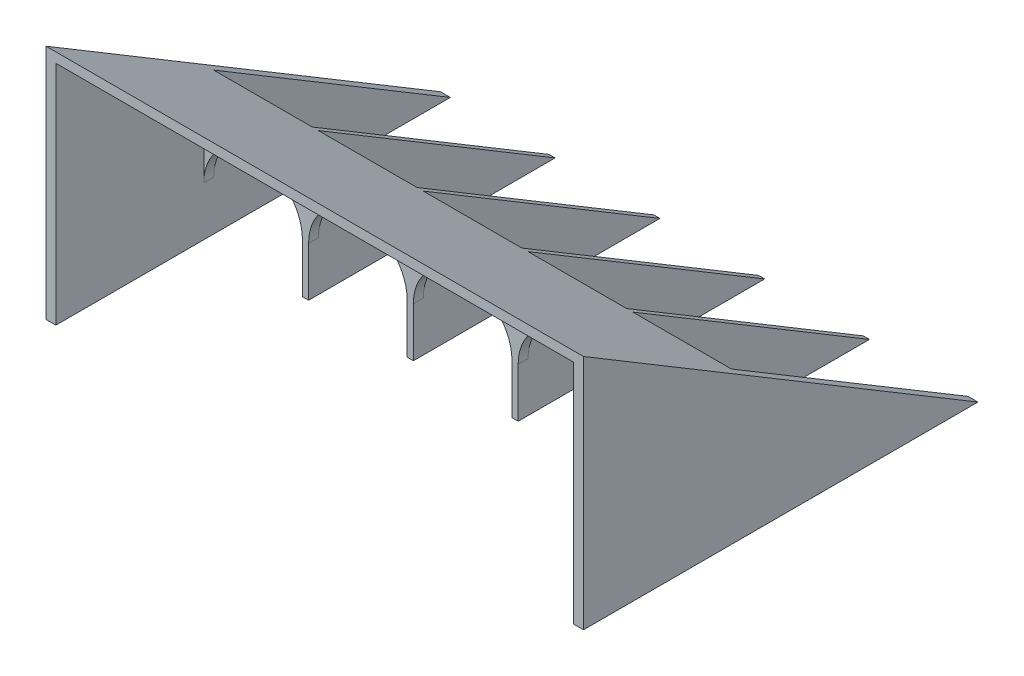
ISO-10303-21;
HEADER;
FILE_DESCRIPTION(('STEP AP214'),'2;1');
FILE_NAME('part.step','',(''),(''),'','','');
FILE_SCHEMA(('AUTOMOTIVE_DESIGN { 1 0 10303 214 1 1 1 1 }'));
ENDSEC;
DATA;
#1=APPLICATION_CONTEXT('core data for automotive mechanical design processes');
#2=APPLICATION_PROTOCOL_DEFINITION('international standard','automotive_design',2000,#1);
#3=PRODUCT_CONTEXT('',#1,'mechanical');
#4=PRODUCT('Part','Part','',(#3));
#5=PRODUCT_RELATED_PRODUCT_CATEGORY('part','',(#4));
#6=PRODUCT_DEFINITION_FORMATION('','',#4);
#7=PRODUCT_DEFINITION_CONTEXT('part definition',#1,'design');
#8=PRODUCT_DEFINITION('design','',#6,#7);
#9=PRODUCT_DEFINITION_SHAPE('','',#8);
#10=(LENGTH_UNIT() NAMED_UNIT(*) SI_UNIT(.MILLI.,.METRE.));
#11=(NAMED_UNIT(*) PLANE_ANGLE_UNIT() SI_UNIT($,.RADIAN.));
#12=(NAMED_UNIT(*) SI_UNIT($,.STERADIAN.) SOLID_ANGLE_UNIT());
#13=UNCERTAINTY_MEASURE_WITH_UNIT(LENGTH_MEASURE(1.E-05),#10,'distance_accuracy_value','');
#14=(GEOMETRIC_REPRESENTATION_CONTEXT(3) GLOBAL_UNCERTAINTY_ASSIGNED_CONTEXT((#13)) GLOBAL_UNIT_ASSIGNED_CONTEXT((#10,
#11,#12)) REPRESENTATION_CONTEXT('',''));
#15=CARTESIAN_POINT('',(0.,0.,0.));
#16=DIRECTION('',(0.,0.,1.));
#17=DIRECTION('',(1.,0.,0.));
#18=AXIS2_PLACEMENT_3D('',#15,#16,#17);
#19=CARTESIAN_POINT('',(218.,-60.,60.));
#20=DIRECTION('',(0.,1.,0.));
#21=DIRECTION('',(0.,0.,1.));
#22=AXIS2_PLACEMENT_3D('',#19,#20,#21);
#23=PLANE('',#22);
#24=DIRECTION('',(0.,0.,-1.));
#25=VECTOR('',#24,1.);
#26=CARTESIAN_POINT('',(214.,-60.,60.));
#27=LINE('',#26,#25);
#28=CARTESIAN_POINT('',(214.,-60.,60.));
#29=VERTEX_POINT('',#28);
#30=CARTESIAN_POINT('',(214.,-60.,-100.));
#31=VERTEX_POINT('',#30);
#32=EDGE_CURVE('E453',#29,#31,#27,.T.);
#33=ORIENTED_EDGE('',*,*,#32,.T.);
#34=DIRECTION('',(-1.,0.,0.));
#35=VECTOR('',#34,1.);
#36=CARTESIAN_POINT('',(218.,-60.,-100.));
#37=LINE('',#36,#35);
#38=CARTESIAN_POINT('',(218.,-60.,-100.));
#39=VERTEX_POINT('',#38);
#40=EDGE_CURVE('E465',#39,#31,#37,.T.);
#41=ORIENTED_EDGE('',*,*,#40,.F.);
#42=DIRECTION('',(0.,0.,-1.));
#43=VECTOR('',#42,1.);
#44=CARTESIAN_POINT('',(218.,-60.,60.));
#45=LINE('',#44,#43);
#46=CARTESIAN_POINT('',(218.,-60.,60.));
#47=VERTEX_POINT('',#46);
#48=EDGE_CURVE('E479',#47,#39,#45,.T.);
#49=ORIENTED_EDGE('',*,*,#48,.F.);
#50=DIRECTION('',(-1.,0.,0.));
#51=VECTOR('',#50,1.);
#52=CARTESIAN_POINT('',(218.,-60.,60.));
#53=LINE('',#52,#51);
#54=EDGE_CURVE('E464',#47,#29,#53,.T.);
#55=ORIENTED_EDGE('',*,*,#54,.T.);
#56=EDGE_LOOP('',(#33,#41,#49,#55));
#57=FACE_BOUND('',#56,.T.);
#58=ADVANCED_FACE('F44',(#57),#23,.F.);
#59=DIRECTION('',(0.,0.,-1.));
#60=VECTOR('',#59,1.);
#61=CARTESIAN_POINT('',(174.,-60.,-4.));
#62=LINE('',#61,#60);
#63=CARTESIAN_POINT('',(174.,-60.,0.));
#64=VERTEX_POINT('',#63);
#65=CARTESIAN_POINT('',(174.,-60.,-100.));
#66=VERTEX_POINT('',#65);
#67=EDGE_CURVE('E278',#64,#66,#62,.T.);
#68=ORIENTED_EDGE('',*,*,#67,.F.);
#69=DIRECTION('',(1.,0.,0.));
#70=VECTOR('',#69,1.);
#71=CARTESIAN_POINT('',(4.,-60.,0.));
#72=LINE('',#71,#70);
#73=CARTESIAN_POINT('',(171.5,-60.,0.));
#74=VERTEX_POINT('',#73);
#75=EDGE_CURVE('E283',#74,#64,#72,.T.);
#76=ORIENTED_EDGE('',*,*,#75,.F.);
#77=DIRECTION('',(0.,0.,1.));
#78=VECTOR('',#77,1.);
#79=CARTESIAN_POINT('',(171.5,-60.,-4.));
#80=LINE('',#79,#78);
#81=CARTESIAN_POINT('',(171.5,-60.,-100.));
#82=VERTEX_POINT('',#81);
#83=EDGE_CURVE('E585',#82,#74,#80,.T.);
#84=ORIENTED_EDGE('',*,*,#83,.F.);
#85=EDGE_CURVE('E285',#66,#82,#37,.T.);
#86=ORIENTED_EDGE('',*,*,#85,.F.);
#87=EDGE_LOOP('',(#68,#76,#84,#86));
#88=FACE_BOUND('',#87,.T.);
#89=ADVANCED_FACE('F280',(#88),#23,.F.);
#90=DIRECTION('',(0.,0.,-1.));
#91=VECTOR('',#90,1.);
#92=CARTESIAN_POINT('',(131.5,-60.,-4.));
#93=LINE('',#92,#91);
#94=CARTESIAN_POINT('',(131.5,-60.,0.));
#95=VERTEX_POINT('',#94);
#96=CARTESIAN_POINT('',(131.5,-60.,-100.));
#97=VERTEX_POINT('',#96);
#98=EDGE_CURVE('E583',#95,#97,#93,.T.);
#99=ORIENTED_EDGE('',*,*,#98,.F.);
#100=CARTESIAN_POINT('',(129.,-60.,0.));
#101=VERTEX_POINT('',#100);
#102=EDGE_CURVE('E300',#101,#95,#72,.T.);
#103=ORIENTED_EDGE('',*,*,#102,.F.);
#104=DIRECTION('',(0.,0.,1.));
#105=VECTOR('',#104,1.);
#106=CARTESIAN_POINT('',(129.,-60.,-4.));
#107=LINE('',#106,#105);
#108=CARTESIAN_POINT('',(129.,-60.,-100.));
#109=VERTEX_POINT('',#108);
#110=EDGE_CURVE('E576',#109,#101,#107,.T.);
#111=ORIENTED_EDGE('',*,*,#110,.F.);
#112=EDGE_CURVE('E790',#97,#109,#37,.T.);
#113=ORIENTED_EDGE('',*,*,#112,.F.);
#114=EDGE_LOOP('',(#99,#103,#111,#113));
#115=FACE_BOUND('',#114,.T.);
#116=ADVANCED_FACE('F520',(#115),#23,.F.);
#117=DIRECTION('',(0.,0.,-1.));
#118=VECTOR('',#117,1.);
#119=CARTESIAN_POINT('',(89.,-60.,-4.));
#120=LINE('',#119,#118);
#121=CARTESIAN_POINT('',(89.,-60.,0.));
#122=VERTEX_POINT('',#121);
#123=CARTESIAN_POINT('',(89.,-60.,-100.));
#124=VERTEX_POINT('',#123);
#125=EDGE_CURVE('E574',#122,#124,#120,.T.);
#126=ORIENTED_EDGE('',*,*,#125,.F.);
#127=CARTESIAN_POINT('',(86.5,-60.,0.));
#128=VERTEX_POINT('',#127);
#129=EDGE_CURVE('E304',#128,#122,#72,.T.);
#130=ORIENTED_EDGE('',*,*,#129,.F.);
#131=DIRECTION('',(0.,0.,1.));
#132=VECTOR('',#131,1.);
#133=CARTESIAN_POINT('',(86.5,-60.,-4.));
#134=LINE('',#133,#132);
#135=CARTESIAN_POINT('',(86.5,-60.,-100.));
#136=VERTEX_POINT('',#135);
#137=EDGE_CURVE('E543',#136,#128,#134,.T.);
#138=ORIENTED_EDGE('',*,*,#137,.F.);
#139=EDGE_CURVE('E788',#124,#136,#37,.T.);
#140=ORIENTED_EDGE('',*,*,#139,.F.);
#141=EDGE_LOOP('',(#126,#130,#138,#140));
#142=FACE_BOUND('',#141,.T.);
#143=ADVANCED_FACE('F527',(#142),#23,.F.);
#144=DIRECTION('',(0.,0.,-1.));
#145=VECTOR('',#144,1.);
#146=CARTESIAN_POINT('',(46.5,-60.,-4.));
#147=LINE('',#146,#145);
#148=CARTESIAN_POINT('',(46.5,-60.,0.));
#149=VERTEX_POINT('',#148);
#150=CARTESIAN_POINT('',(46.5,-60.,-100.));
#151=VERTEX_POINT('',#150);
#152=EDGE_CURVE('E536',#149,#151,#147,.T.);
#153=ORIENTED_EDGE('',*,*,#152,.F.);
#154=CARTESIAN_POINT('',(44.,-60.,0.));
#155=VERTEX_POINT('',#154);
#156=EDGE_CURVE('E326',#155,#149,#72,.T.);
#157=ORIENTED_EDGE('',*,*,#156,.F.);
#158=DIRECTION('',(0.,0.,1.));
#159=VECTOR('',#158,1.);
#160=CARTESIAN_POINT('',(44.,-60.,-4.));
#161=LINE('',#160,#159);
#162=CARTESIAN_POINT('',(44.,-60.,-100.));
#163=VERTEX_POINT('',#162);
#164=EDGE_CURVE('E560',#163,#155,#161,.T.);
#165=ORIENTED_EDGE('',*,*,#164,.F.);
#166=EDGE_CURVE('E540',#151,#163,#37,.T.);
#167=ORIENTED_EDGE('',*,*,#166,.F.);
#168=EDGE_LOOP('',(#153,#157,#165,#167));
#169=FACE_BOUND('',#168,.T.);
#170=ADVANCED_FACE('F522',(#169),#23,.F.);
#171=CARTESIAN_POINT('',(218.,-60.,-100.));
#172=DIRECTION('',(0.,-0.857492925712544,0.514495755427526));
#173=DIRECTION('',(0.,-0.514495755427526,-0.857492925712544));
#174=AXIS2_PLACEMENT_3D('',#171,#172,#173);
#175=PLANE('',#174);
#176=DIRECTION('',(-1.,0.,0.));
#177=VECTOR('',#176,1.);
#178=CARTESIAN_POINT('',(218.,-2.40000000000002,-4.));
#179=LINE('',#178,#177);
#180=CARTESIAN_POINT('',(44.,-2.40000000000003,-4.));
#181=VERTEX_POINT('',#180);
#182=CARTESIAN_POINT('',(3.99999999999999,-2.40000000000002,-4.));
#183=VERTEX_POINT('',#182);
#184=EDGE_CURVE('E629',#181,#183,#179,.T.);
#185=ORIENTED_EDGE('',*,*,#184,.T.);
#186=DIRECTION('',(0.,-0.514495755427526,-0.857492925712544));
#187=VECTOR('',#186,1.);
#188=CARTESIAN_POINT('',(3.99999999999998,-60.,-100.));
#189=LINE('',#188,#187);
#190=CARTESIAN_POINT('',(4.,-60.,-100.));
#191=VERTEX_POINT('',#190);
#192=EDGE_CURVE('E440',#183,#191,#189,.T.);
#193=ORIENTED_EDGE('',*,*,#192,.T.);
#194=CARTESIAN_POINT('',(0.,-60.,-100.));
#195=VERTEX_POINT('',#194);
#196=EDGE_CURVE('E496',#191,#195,#37,.T.);
#197=ORIENTED_EDGE('',*,*,#196,.T.);
#198=DIRECTION('',(0.,0.514495755427526,0.857492925712544));
#199=VECTOR('',#198,1.);
#200=CARTESIAN_POINT('',(0.,-60.,-100.));
#201=LINE('',#200,#199);
#202=CARTESIAN_POINT('',(0.,36.,60.));
#203=VERTEX_POINT('',#202);
#204=EDGE_CURVE('E340',#195,#203,#201,.T.);
#205=ORIENTED_EDGE('',*,*,#204,.T.);
#206=DIRECTION('',(-1.,0.,0.));
#207=VECTOR('',#206,1.);
#208=CARTESIAN_POINT('',(218.,36.,60.));
#209=LINE('',#208,#207);
#210=CARTESIAN_POINT('',(218.,36.,60.));
#211=VERTEX_POINT('',#210);
#212=EDGE_CURVE('E470',#211,#203,#209,.T.);
#213=ORIENTED_EDGE('',*,*,#212,.F.);
#214=DIRECTION('',(0.,0.514495755427526,0.857492925712544));
#215=VECTOR('',#214,1.);
#216=CARTESIAN_POINT('',(218.,-60.,-100.));
#217=LINE('',#216,#215);
#218=EDGE_CURVE('E483',#39,#211,#217,.T.);
#219=ORIENTED_EDGE('',*,*,#218,.F.);
#220=ORIENTED_EDGE('',*,*,#40,.T.);
#221=DIRECTION('',(0.,0.514495755427526,0.857492925712544));
#222=VECTOR('',#221,1.);
#223=CARTESIAN_POINT('',(214.,-60.,-100.));
#224=LINE('',#223,#222);
#225=CARTESIAN_POINT('',(214.,-2.40000000000002,-4.));
#226=VERTEX_POINT('',#225);
#227=EDGE_CURVE('E567',#31,#226,#224,.T.);
#228=ORIENTED_EDGE('',*,*,#227,.T.);
#229=DIRECTION('',(-1.,0.,0.));
#230=VECTOR('',#229,1.);
#231=CARTESIAN_POINT('',(218.,-2.40000000000002,-4.));
#232=LINE('',#231,#230);
#233=CARTESIAN_POINT('',(174.,-2.40000000000002,-4.));
#234=VERTEX_POINT('',#233);
#235=EDGE_CURVE('E595',#226,#234,#232,.T.);
#236=ORIENTED_EDGE('',*,*,#235,.T.);
#237=DIRECTION('',(0.,-0.514495755427526,-0.857492925712544));
#238=VECTOR('',#237,1.);
#239=CARTESIAN_POINT('',(174.,-60.,-100.));
#240=LINE('',#239,#238);
#241=EDGE_CURVE('E598',#234,#66,#240,.T.);
#242=ORIENTED_EDGE('',*,*,#241,.T.);
#243=ORIENTED_EDGE('',*,*,#85,.T.);
#244=DIRECTION('',(0.,0.514495755427526,0.857492925712544));
#245=VECTOR('',#244,1.);
#246=CARTESIAN_POINT('',(171.5,-60.,-100.));
#247=LINE('',#246,#245);
#248=CARTESIAN_POINT('',(171.5,-2.40000000000002,-4.));
#249=VERTEX_POINT('',#248);
#250=EDGE_CURVE('E600',#82,#249,#247,.T.);
#251=ORIENTED_EDGE('',*,*,#250,.T.);
#252=DIRECTION('',(-1.,0.,0.));
#253=VECTOR('',#252,1.);
#254=CARTESIAN_POINT('',(218.,-2.40000000000002,-4.));
#255=LINE('',#254,#253);
#256=CARTESIAN_POINT('',(131.5,-2.40000000000002,-4.));
#257=VERTEX_POINT('',#256);
#258=EDGE_CURVE('E603',#249,#257,#255,.T.);
#259=ORIENTED_EDGE('',*,*,#258,.T.);
#260=DIRECTION('',(0.,-0.514495755427526,-0.857492925712544));
#261=VECTOR('',#260,1.);
#262=CARTESIAN_POINT('',(131.5,-60.,-100.));
#263=LINE('',#262,#261);
#264=EDGE_CURVE('E606',#257,#97,#263,.T.);
#265=ORIENTED_EDGE('',*,*,#264,.T.);
#266=ORIENTED_EDGE('',*,*,#112,.T.);
#267=DIRECTION('',(0.,0.514495755427526,0.857492925712544));
#268=VECTOR('',#267,1.);
#269=CARTESIAN_POINT('',(129.,-60.,-100.));
#270=LINE('',#269,#268);
#271=CARTESIAN_POINT('',(129.,-2.40000000000002,-4.));
#272=VERTEX_POINT('',#271);
#273=EDGE_CURVE('E609',#109,#272,#270,.T.);
#274=ORIENTED_EDGE('',*,*,#273,.T.);
#275=DIRECTION('',(-1.,0.,0.));
#276=VECTOR('',#275,1.);
#277=CARTESIAN_POINT('',(218.,-2.40000000000002,-4.));
#278=LINE('',#277,#276);
#279=CARTESIAN_POINT('',(89.,-2.40000000000002,-4.));
#280=VERTEX_POINT('',#279);
#281=EDGE_CURVE('E612',#272,#280,#278,.T.);
#282=ORIENTED_EDGE('',*,*,#281,.T.);
#283=DIRECTION('',(0.,-0.514495755427526,-0.857492925712544));
#284=VECTOR('',#283,1.);
#285=CARTESIAN_POINT('',(89.,-60.,-100.));
#286=LINE('',#285,#284);
#287=EDGE_CURVE('E615',#280,#124,#286,.T.);
#288=ORIENTED_EDGE('',*,*,#287,.T.);
#289=ORIENTED_EDGE('',*,*,#139,.T.);
#290=DIRECTION('',(0.,0.514495755427526,0.857492925712544));
#291=VECTOR('',#290,1.);
#292=CARTESIAN_POINT('',(86.5,-60.,-100.));
#293=LINE('',#292,#291);
#294=CARTESIAN_POINT('',(86.5,-2.40000000000002,-4.));
#295=VERTEX_POINT('',#294);
#296=EDGE_CURVE('E618',#136,#295,#293,.T.);
#297=ORIENTED_EDGE('',*,*,#296,.T.);
#298=DIRECTION('',(-1.,0.,0.));
#299=VECTOR('',#298,1.);
#300=CARTESIAN_POINT('',(218.,-2.40000000000002,-4.));
#301=LINE('',#300,#299);
#302=CARTESIAN_POINT('',(46.5,-2.40000000000002,-4.));
#303=VERTEX_POINT('',#302);
#304=EDGE_CURVE('E621',#295,#303,#301,.T.);
#305=ORIENTED_EDGE('',*,*,#304,.T.);
#306=DIRECTION('',(0.,-0.514495755427526,-0.857492925712544));
#307=VECTOR('',#306,1.);
#308=CARTESIAN_POINT('',(46.5,-60.,-100.));
#309=LINE('',#308,#307);
#310=EDGE_CURVE('E624',#303,#151,#309,.T.);
#311=ORIENTED_EDGE('',*,*,#310,.T.);
#312=ORIENTED_EDGE('',*,*,#166,.T.);
#313=DIRECTION('',(0.,0.514495755427526,0.857492925712544));
#314=VECTOR('',#313,1.);
#315=CARTESIAN_POINT('',(44.,-60.,-100.));
#316=LINE('',#315,#314);
#317=EDGE_CURVE('E626',#163,#181,#316,.T.);
#318=ORIENTED_EDGE('',*,*,#317,.T.);
#319=EDGE_LOOP('',(#185,#193,#197,#205,#213,#219,#220,#228,#236,#242,#243,#251,#259,#265,#266,
#274,#282,#288,#289,#297,#305,#311,#312,#318));
#320=FACE_BOUND('',#319,.T.);
#321=ADVANCED_FACE('F492',(#320),#175,.F.);
#322=CARTESIAN_POINT('',(218.,36.,60.));
#323=DIRECTION('',(0.,0.,-1.));
#324=DIRECTION('',(0.,1.,0.));
#325=AXIS2_PLACEMENT_3D('',#322,#323,#324);
#326=PLANE('',#325);
#327=CARTESIAN_POINT('',(4.00000000000001,-60.,60.));
#328=VERTEX_POINT('',#327);
#329=CARTESIAN_POINT('',(0.,-60.,60.));
#330=VERTEX_POINT('',#329);
#331=EDGE_CURVE('E461',#328,#330,#53,.T.);
#332=ORIENTED_EDGE('',*,*,#331,.F.);
#333=DIRECTION('',(0.,-1.,0.));
#334=VECTOR('',#333,1.);
#335=CARTESIAN_POINT('',(4.,32.,60.));
#336=LINE('',#335,#334);
#337=CARTESIAN_POINT('',(4.,32.,60.));
#338=VERTEX_POINT('',#337);
#339=EDGE_CURVE('E438',#338,#328,#336,.T.);
#340=ORIENTED_EDGE('',*,*,#339,.F.);
#341=DIRECTION('',(-1.,0.,0.));
#342=VECTOR('',#341,1.);
#343=CARTESIAN_POINT('',(4.,32.,60.));
#344=LINE('',#343,#342);
#345=CARTESIAN_POINT('',(214.,32.,60.));
#346=VERTEX_POINT('',#345);
#347=EDGE_CURVE('E441',#346,#338,#344,.T.);
#348=ORIENTED_EDGE('',*,*,#347,.F.);
#349=DIRECTION('',(0.,1.,0.));
#350=VECTOR('',#349,1.);
#351=CARTESIAN_POINT('',(214.,32.,60.));
#352=LINE('',#351,#350);
#353=EDGE_CURVE('E320',#29,#346,#352,.T.);
#354=ORIENTED_EDGE('',*,*,#353,.F.);
#355=ORIENTED_EDGE('',*,*,#54,.F.);
#356=DIRECTION('',(0.,-1.,0.));
#357=VECTOR('',#356,1.);
#358=CARTESIAN_POINT('',(218.,36.,60.));
#359=LINE('',#358,#357);
#360=EDGE_CURVE('E480',#211,#47,#359,.T.);
#361=ORIENTED_EDGE('',*,*,#360,.F.);
#362=ORIENTED_EDGE('',*,*,#212,.T.);
#363=DIRECTION('',(0.,-1.,0.));
#364=VECTOR('',#363,1.);
#365=CARTESIAN_POINT('',(0.,36.,60.));
#366=LINE('',#365,#364);
#367=EDGE_CURVE('E500',#203,#330,#366,.T.);
#368=ORIENTED_EDGE('',*,*,#367,.T.);
#369=EDGE_LOOP('',(#332,#340,#348,#354,#355,#361,#362,#368));
#370=FACE_BOUND('',#369,.T.);
#371=ADVANCED_FACE('F459',(#370),#326,.F.);
#372=ORIENTED_EDGE('',*,*,#196,.F.);
#373=DIRECTION('',(0.,0.,-1.));
#374=VECTOR('',#373,1.);
#375=CARTESIAN_POINT('',(4.00000000000001,-60.,60.));
#376=LINE('',#375,#374);
#377=EDGE_CURVE('E307',#328,#191,#376,.T.);
#378=ORIENTED_EDGE('',*,*,#377,.F.);
#379=ORIENTED_EDGE('',*,*,#331,.T.);
#380=DIRECTION('',(0.,0.,-1.));
#381=VECTOR('',#380,1.);
#382=CARTESIAN_POINT('',(0.,-60.,60.));
#383=LINE('',#382,#381);
#384=EDGE_CURVE('E489',#330,#195,#383,.T.);
#385=ORIENTED_EDGE('',*,*,#384,.T.);
#386=EDGE_LOOP('',(#372,#378,#379,#385));
#387=FACE_BOUND('',#386,.T.);
#388=ADVANCED_FACE('F505',(#387),#23,.F.);
#389=CARTESIAN_POINT('',(218.,0.,0.));
#390=DIRECTION('',(1.,0.,0.));
#391=DIRECTION('',(0.,0.,-1.));
#392=AXIS2_PLACEMENT_3D('',#389,#390,#391);
#393=PLANE('',#392);
#394=ORIENTED_EDGE('',*,*,#218,.T.);
#395=ORIENTED_EDGE('',*,*,#360,.T.);
#396=ORIENTED_EDGE('',*,*,#48,.T.);
#397=EDGE_LOOP('',(#394,#395,#396));
#398=FACE_BOUND('',#397,.T.);
#399=ADVANCED_FACE('F486',(#398),#393,.T.);
#400=CARTESIAN_POINT('',(0.,0.,0.));
#401=DIRECTION('',(1.,0.,0.));
#402=DIRECTION('',(0.,0.,-1.));
#403=AXIS2_PLACEMENT_3D('',#400,#401,#402);
#404=PLANE('',#403);
#405=ORIENTED_EDGE('',*,*,#204,.F.);
#406=ORIENTED_EDGE('',*,*,#384,.F.);
#407=ORIENTED_EDGE('',*,*,#367,.F.);
#408=EDGE_LOOP('',(#405,#406,#407));
#409=FACE_BOUND('',#408,.T.);
#410=ADVANCED_FACE('F507',(#409),#404,.F.);
#411=CARTESIAN_POINT('',(0.,0.,0.));
#412=DIRECTION('',(0.,0.,1.));
#413=DIRECTION('',(1.,0.,0.));
#414=AXIS2_PLACEMENT_3D('',#411,#412,#413);
#415=PLANE('',#414);
#416=CARTESIAN_POINT('',(194.,-40.,0.));
#417=DIRECTION('',(0.,0.,1.));
#418=DIRECTION('',(1.,0.,0.));
#419=AXIS2_PLACEMENT_3D('',#416,#417,#418);
#420=CIRCLE('',#419,20.);
#421=CARTESIAN_POINT('',(174.,-40.,0.));
#422=VERTEX_POINT('',#421);
#423=CARTESIAN_POINT('',(194.,-20.,0.));
#424=VERTEX_POINT('',#423);
#425=EDGE_CURVE('E67',#422,#424,#420,.F.);
#426=ORIENTED_EDGE('',*,*,#425,.T.);
#427=CARTESIAN_POINT('',(194.,-40.,0.));
#428=DIRECTION('',(0.,0.,1.));
#429=DIRECTION('',(1.,0.,0.));
#430=AXIS2_PLACEMENT_3D('',#427,#428,#429);
#431=CIRCLE('',#430,20.);
#432=CARTESIAN_POINT('',(214.,-40.,0.));
#433=VERTEX_POINT('',#432);
#434=EDGE_CURVE('E12',#424,#433,#431,.F.);
#435=ORIENTED_EDGE('',*,*,#434,.T.);
#436=CARTESIAN_POINT('',(214.,-20.,0.));
#437=DIRECTION('',(0.,-1.,0.));
#438=VECTOR('',#437,1.);
#439=LINE('',#436,#438);
#440=CARTESIAN_POINT('',(214.,-20.,0.));
#441=VERTEX_POINT('',#440);
#442=EDGE_CURVE('E60',#441,#433,#439,.T.);
#443=ORIENTED_EDGE('',*,*,#442,.F.);
#444=DIRECTION('',(0.,1.,0.));
#445=VECTOR('',#444,1.);
#446=CARTESIAN_POINT('',(214.,-3.99999999999998,0.));
#447=LINE('',#446,#445);
#448=CARTESIAN_POINT('',(214.,-3.99999999999998,0.));
#449=VERTEX_POINT('',#448);
#450=EDGE_CURVE('E332',#441,#449,#447,.T.);
#451=ORIENTED_EDGE('',*,*,#450,.T.);
#452=DIRECTION('',(-1.,0.,0.));
#453=VECTOR('',#452,1.);
#454=CARTESIAN_POINT('',(4.,-4.,0.));
#455=LINE('',#454,#453);
#456=CARTESIAN_POINT('',(4.,-4.,0.));
#457=VERTEX_POINT('',#456);
#458=EDGE_CURVE('E335',#449,#457,#455,.T.);
#459=ORIENTED_EDGE('',*,*,#458,.T.);
#460=DIRECTION('',(0.,-1.,0.));
#461=VECTOR('',#460,1.);
#462=CARTESIAN_POINT('',(4.,-4.,0.));
#463=LINE('',#462,#461);
#464=CARTESIAN_POINT('',(3.99999999999999,-20.,0.));
#465=VERTEX_POINT('',#464);
#466=EDGE_CURVE('E301',#457,#465,#463,.T.);
#467=ORIENTED_EDGE('',*,*,#466,.T.);
#468=CARTESIAN_POINT('',(4.,-40.,0.));
#469=DIRECTION('',(0.,1.,0.));
#470=VECTOR('',#469,1.);
#471=LINE('',#468,#470);
#472=CARTESIAN_POINT('',(4.,-40.,0.));
#473=VERTEX_POINT('',#472);
#474=EDGE_CURVE('E374',#473,#465,#471,.T.);
#475=ORIENTED_EDGE('',*,*,#474,.F.);
#476=CARTESIAN_POINT('',(24.,-40.,0.));
#477=DIRECTION('',(0.,0.,1.));
#478=DIRECTION('',(1.,0.,0.));
#479=AXIS2_PLACEMENT_3D('',#476,#477,#478);
#480=CIRCLE('',#479,20.);
#481=CARTESIAN_POINT('',(24.,-20.,0.));
#482=VERTEX_POINT('',#481);
#483=EDGE_CURVE('E707',#473,#482,#480,.F.);
#484=ORIENTED_EDGE('',*,*,#483,.T.);
#485=CARTESIAN_POINT('',(24.,-40.,0.));
#486=DIRECTION('',(0.,0.,1.));
#487=DIRECTION('',(1.,0.,0.));
#488=AXIS2_PLACEMENT_3D('',#485,#486,#487);
#489=CIRCLE('',#488,20.);
#490=CARTESIAN_POINT('',(44.,-40.,0.));
#491=VERTEX_POINT('',#490);
#492=EDGE_CURVE('E706',#482,#491,#489,.F.);
#493=ORIENTED_EDGE('',*,*,#492,.T.);
#494=DIRECTION('',(0.,-1.,0.));
#495=VECTOR('',#494,1.);
#496=CARTESIAN_POINT('',(44.,-20.,0.));
#497=LINE('',#496,#495);
#498=EDGE_CURVE('E550',#491,#155,#497,.T.);
#499=ORIENTED_EDGE('',*,*,#498,.T.);
#500=ORIENTED_EDGE('',*,*,#156,.T.);
#501=DIRECTION('',(0.,1.,0.));
#502=VECTOR('',#501,1.);
#503=CARTESIAN_POINT('',(46.5,-60.,0.));
#504=LINE('',#503,#502);
#505=CARTESIAN_POINT('',(46.5,-40.,0.));
#506=VERTEX_POINT('',#505);
#507=EDGE_CURVE('E546',#149,#506,#504,.T.);
#508=ORIENTED_EDGE('',*,*,#507,.T.);
#509=CARTESIAN_POINT('',(66.5,-40.,0.));
#510=DIRECTION('',(0.,0.,1.));
#511=DIRECTION('',(1.,0.,0.));
#512=AXIS2_PLACEMENT_3D('',#509,#510,#511);
#513=CIRCLE('',#512,20.);
#514=CARTESIAN_POINT('',(66.5,-20.,0.));
#515=VERTEX_POINT('',#514);
#516=EDGE_CURVE('E716',#506,#515,#513,.F.);
#517=ORIENTED_EDGE('',*,*,#516,.T.);
#518=CARTESIAN_POINT('',(66.5,-40.,0.));
#519=DIRECTION('',(0.,0.,1.));
#520=DIRECTION('',(1.,0.,0.));
#521=AXIS2_PLACEMENT_3D('',#518,#519,#520);
#522=CIRCLE('',#521,20.);
#523=CARTESIAN_POINT('',(86.5,-40.,0.));
#524=VERTEX_POINT('',#523);
#525=EDGE_CURVE('E720',#515,#524,#522,.F.);
#526=ORIENTED_EDGE('',*,*,#525,.T.);
#527=DIRECTION('',(0.,-1.,0.));
#528=VECTOR('',#527,1.);
#529=CARTESIAN_POINT('',(86.5,-20.,0.));
#530=LINE('',#529,#528);
#531=EDGE_CURVE('E549',#524,#128,#530,.T.);
#532=ORIENTED_EDGE('',*,*,#531,.T.);
#533=ORIENTED_EDGE('',*,*,#129,.T.);
#534=DIRECTION('',(0.,1.,0.));
#535=VECTOR('',#534,1.);
#536=CARTESIAN_POINT('',(89.,-60.,0.));
#537=LINE('',#536,#535);
#538=CARTESIAN_POINT('',(89.,-40.,0.));
#539=VERTEX_POINT('',#538);
#540=EDGE_CURVE('E552',#122,#539,#537,.T.);
#541=ORIENTED_EDGE('',*,*,#540,.T.);
#542=CARTESIAN_POINT('',(109.,-40.,0.));
#543=DIRECTION('',(0.,0.,1.));
#544=DIRECTION('',(1.,0.,0.));
#545=AXIS2_PLACEMENT_3D('',#542,#543,#544);
#546=CIRCLE('',#545,20.);
#547=CARTESIAN_POINT('',(109.,-20.,0.));
#548=VERTEX_POINT('',#547);
#549=EDGE_CURVE('E725',#539,#548,#546,.F.);
#550=ORIENTED_EDGE('',*,*,#549,.T.);
#551=CARTESIAN_POINT('',(109.,-40.,0.));
#552=DIRECTION('',(0.,0.,1.));
#553=DIRECTION('',(1.,0.,0.));
#554=AXIS2_PLACEMENT_3D('',#551,#552,#553);
#555=CIRCLE('',#554,20.);
#556=CARTESIAN_POINT('',(129.,-40.,0.));
#557=VERTEX_POINT('',#556);
#558=EDGE_CURVE('E729',#548,#557,#555,.F.);
#559=ORIENTED_EDGE('',*,*,#558,.T.);
#560=DIRECTION('',(0.,-1.,0.));
#561=VECTOR('',#560,1.);
#562=CARTESIAN_POINT('',(129.,-20.,0.));
#563=LINE('',#562,#561);
#564=EDGE_CURVE('E557',#557,#101,#563,.T.);
#565=ORIENTED_EDGE('',*,*,#564,.T.);
#566=ORIENTED_EDGE('',*,*,#102,.T.);
#567=DIRECTION('',(0.,1.,0.));
#568=VECTOR('',#567,1.);
#569=CARTESIAN_POINT('',(131.5,-60.,0.));
#570=LINE('',#569,#568);
#571=CARTESIAN_POINT('',(131.5,-40.,0.));
#572=VERTEX_POINT('',#571);
#573=EDGE_CURVE('E1098',#95,#572,#570,.T.);
#574=ORIENTED_EDGE('',*,*,#573,.T.);
#575=CARTESIAN_POINT('',(151.5,-40.,0.));
#576=DIRECTION('',(0.,0.,1.));
#577=DIRECTION('',(1.,0.,0.));
#578=AXIS2_PLACEMENT_3D('',#575,#576,#577);
#579=CIRCLE('',#578,20.);
#580=CARTESIAN_POINT('',(151.5,-20.,0.));
#581=VERTEX_POINT('',#580);
#582=EDGE_CURVE('E734',#572,#581,#579,.F.);
#583=ORIENTED_EDGE('',*,*,#582,.T.);
#584=CARTESIAN_POINT('',(151.5,-40.,0.));
#585=DIRECTION('',(0.,0.,1.));
#586=DIRECTION('',(1.,0.,0.));
#587=AXIS2_PLACEMENT_3D('',#584,#585,#586);
#588=CIRCLE('',#587,20.);
#589=CARTESIAN_POINT('',(171.5,-40.,0.));
#590=VERTEX_POINT('',#589);
#591=EDGE_CURVE('E738',#581,#590,#588,.F.);
#592=ORIENTED_EDGE('',*,*,#591,.T.);
#593=DIRECTION('',(0.,-1.,0.));
#594=VECTOR('',#593,1.);
#595=CARTESIAN_POINT('',(171.5,-20.,0.));
#596=LINE('',#595,#594);
#597=EDGE_CURVE('E295',#590,#74,#596,.T.);
#598=ORIENTED_EDGE('',*,*,#597,.T.);
#599=ORIENTED_EDGE('',*,*,#75,.T.);
#600=DIRECTION('',(0.,1.,0.));
#601=VECTOR('',#600,1.);
#602=CARTESIAN_POINT('',(174.,-60.,0.));
#603=LINE('',#602,#601);
#604=EDGE_CURVE('E289',#64,#422,#603,.T.);
#605=ORIENTED_EDGE('',*,*,#604,.T.);
#606=EDGE_LOOP('',(#426,#435,#443,#451,#459,#467,#475,#484,#493,#499,#500,#508,#517,#526,#532,
#533,#541,#550,#559,#565,#566,#574,#583,#592,#598,#599,#605));
#607=FACE_BOUND('',#606,.T.);
#608=ADVANCED_FACE('F297',(#607),#415,.T.);
#609=CARTESIAN_POINT('',(0.,-2.94117647058824,1.76470588235294));
#610=DIRECTION('',(0.,0.857492925712545,-0.514495755427526));
#611=DIRECTION('',(0.,0.514495755427526,0.857492925712544));
#612=AXIS2_PLACEMENT_3D('',#609,#610,#611);
#613=PLANE('',#612);
#614=DIRECTION('',(0.,-0.514495755427526,-0.857492925712544));
#615=VECTOR('',#614,1.);
#616=CARTESIAN_POINT('',(214.,32.,60.));
#617=LINE('',#616,#615);
#618=EDGE_CURVE('E442',#346,#449,#617,.T.);
#619=ORIENTED_EDGE('',*,*,#618,.F.);
#620=ORIENTED_EDGE('',*,*,#347,.T.);
#621=DIRECTION('',(0.,-0.514495755427526,-0.857492925712544));
#622=VECTOR('',#621,1.);
#623=CARTESIAN_POINT('',(4.,32.,60.));
#624=LINE('',#623,#622);
#625=EDGE_CURVE('E448',#338,#457,#624,.T.);
#626=ORIENTED_EDGE('',*,*,#625,.T.);
#627=ORIENTED_EDGE('',*,*,#458,.F.);
#628=EDGE_LOOP('',(#619,#620,#626,#627));
#629=FACE_BOUND('',#628,.T.);
#630=ADVANCED_FACE('F514',(#629),#613,.F.);
#631=CARTESIAN_POINT('',(4.,0.,0.));
#632=DIRECTION('',(-1.,0.,0.));
#633=DIRECTION('',(0.,0.,1.));
#634=AXIS2_PLACEMENT_3D('',#631,#632,#633);
#635=PLANE('',#634);
#636=DIRECTION('',(0.,-1.,0.));
#637=VECTOR('',#636,1.);
#638=CARTESIAN_POINT('',(3.99999999999999,0.,-4.));
#639=LINE('',#638,#637);
#640=CARTESIAN_POINT('',(4.,-40.,-4.));
#641=VERTEX_POINT('',#640);
#642=EDGE_CURVE('E565',#183,#641,#639,.T.);
#643=ORIENTED_EDGE('',*,*,#642,.T.);
#644=DIRECTION('',(0.,0.,-1.));
#645=VECTOR('',#644,1.);
#646=CARTESIAN_POINT('',(4.,-40.,0.));
#647=LINE('',#646,#645);
#648=EDGE_CURVE('E370',#641,#473,#647,.F.);
#649=ORIENTED_EDGE('',*,*,#648,.T.);
#650=ORIENTED_EDGE('',*,*,#474,.T.);
#651=ORIENTED_EDGE('',*,*,#466,.F.);
#652=ORIENTED_EDGE('',*,*,#625,.F.);
#653=ORIENTED_EDGE('',*,*,#339,.T.);
#654=ORIENTED_EDGE('',*,*,#377,.T.);
#655=ORIENTED_EDGE('',*,*,#192,.F.);
#656=EDGE_LOOP('',(#643,#649,#650,#651,#652,#653,#654,#655));
#657=FACE_BOUND('',#656,.T.);
#658=ADVANCED_FACE('F414',(#657),#635,.F.);
#659=CARTESIAN_POINT('',(214.,0.,0.));
#660=DIRECTION('',(1.,0.,0.));
#661=DIRECTION('',(0.,0.,-1.));
#662=AXIS2_PLACEMENT_3D('',#659,#660,#661);
#663=PLANE('',#662);
#664=DIRECTION('',(0.,0.,-1.));
#665=VECTOR('',#664,1.);
#666=CARTESIAN_POINT('',(214.,-40.,-4.));
#667=LINE('',#666,#665);
#668=CARTESIAN_POINT('',(214.,-40.,-4.));
#669=VERTEX_POINT('',#668);
#670=EDGE_CURVE('E405',#433,#669,#667,.T.);
#671=ORIENTED_EDGE('',*,*,#670,.T.);
#672=DIRECTION('',(0.,-1.,0.));
#673=VECTOR('',#672,1.);
#674=CARTESIAN_POINT('',(214.,0.,-4.));
#675=LINE('',#674,#673);
#676=EDGE_CURVE('E288',#226,#669,#675,.T.);
#677=ORIENTED_EDGE('',*,*,#676,.F.);
#678=ORIENTED_EDGE('',*,*,#227,.F.);
#679=ORIENTED_EDGE('',*,*,#32,.F.);
#680=ORIENTED_EDGE('',*,*,#353,.T.);
#681=ORIENTED_EDGE('',*,*,#618,.T.);
#682=ORIENTED_EDGE('',*,*,#450,.F.);
#683=ORIENTED_EDGE('',*,*,#442,.T.);
#684=EDGE_LOOP('',(#671,#677,#678,#679,#680,#681,#682,#683));
#685=FACE_BOUND('',#684,.T.);
#686=ADVANCED_FACE('F406',(#685),#663,.F.);
#687=CARTESIAN_POINT('',(174.,0.,-4.));
#688=DIRECTION('',(-1.,0.,0.));
#689=DIRECTION('',(0.,0.,1.));
#690=AXIS2_PLACEMENT_3D('',#687,#688,#689);
#691=PLANE('',#690);
#692=DIRECTION('',(0.,-1.,0.));
#693=VECTOR('',#692,1.);
#694=CARTESIAN_POINT('',(174.,0.,-4.));
#695=LINE('',#694,#693);
#696=CARTESIAN_POINT('',(174.,-40.,-4.));
#697=VERTEX_POINT('',#696);
#698=EDGE_CURVE('E586',#234,#697,#695,.T.);
#699=ORIENTED_EDGE('',*,*,#698,.T.);
#700=DIRECTION('',(0.,0.,-1.));
#701=VECTOR('',#700,1.);
#702=CARTESIAN_POINT('',(174.,-40.,0.));
#703=LINE('',#702,#701);
#704=EDGE_CURVE('E294',#697,#422,#703,.F.);
#705=ORIENTED_EDGE('',*,*,#704,.T.);
#706=ORIENTED_EDGE('',*,*,#604,.F.);
#707=ORIENTED_EDGE('',*,*,#67,.T.);
#708=ORIENTED_EDGE('',*,*,#241,.F.);
#709=EDGE_LOOP('',(#699,#705,#706,#707,#708));
#710=FACE_BOUND('',#709,.T.);
#711=ADVANCED_FACE('F292',(#710),#691,.F.);
#712=CARTESIAN_POINT('',(174.,0.,-4.));
#713=DIRECTION('',(0.,0.,1.));
#714=DIRECTION('',(0.,-1.,0.));
#715=AXIS2_PLACEMENT_3D('',#712,#713,#714);
#716=PLANE('',#715);
#717=ORIENTED_EDGE('',*,*,#676,.T.);
#718=CARTESIAN_POINT('',(194.,-40.,-4.));
#719=DIRECTION('',(0.,0.,1.));
#720=DIRECTION('',(0.,-1.,0.));
#721=AXIS2_PLACEMENT_3D('',#718,#719,#720);
#722=CIRCLE('',#721,20.);
#723=CARTESIAN_POINT('',(194.,-20.,-4.));
#724=VERTEX_POINT('',#723);
#725=EDGE_CURVE('E53',#669,#724,#722,.T.);
#726=ORIENTED_EDGE('',*,*,#725,.T.);
#727=CARTESIAN_POINT('',(194.,-40.,-4.));
#728=DIRECTION('',(0.,0.,1.));
#729=DIRECTION('',(0.,-1.,0.));
#730=AXIS2_PLACEMENT_3D('',#727,#728,#729);
#731=CIRCLE('',#730,20.);
#732=EDGE_CURVE('E740',#724,#697,#731,.T.);
#733=ORIENTED_EDGE('',*,*,#732,.T.);
#734=ORIENTED_EDGE('',*,*,#698,.F.);
#735=ORIENTED_EDGE('',*,*,#235,.F.);
#736=EDGE_LOOP('',(#717,#726,#733,#734,#735));
#737=FACE_BOUND('',#736,.T.);
#738=ADVANCED_FACE('F646',(#737),#716,.F.);
#739=CARTESIAN_POINT('',(131.5,0.,-4.));
#740=DIRECTION('',(-1.,0.,0.));
#741=DIRECTION('',(0.,0.,1.));
#742=AXIS2_PLACEMENT_3D('',#739,#740,#741);
#743=PLANE('',#742);
#744=DIRECTION('',(0.,-1.,0.));
#745=VECTOR('',#744,1.);
#746=CARTESIAN_POINT('',(131.5,0.,-4.));
#747=LINE('',#746,#745);
#748=CARTESIAN_POINT('',(131.5,-40.,-4.));
#749=VERTEX_POINT('',#748);
#750=EDGE_CURVE('E577',#257,#749,#747,.T.);
#751=ORIENTED_EDGE('',*,*,#750,.T.);
#752=DIRECTION('',(0.,0.,-1.));
#753=VECTOR('',#752,1.);
#754=CARTESIAN_POINT('',(131.5,-40.,0.));
#755=LINE('',#754,#753);
#756=EDGE_CURVE('E391',#749,#572,#755,.F.);
#757=ORIENTED_EDGE('',*,*,#756,.T.);
#758=ORIENTED_EDGE('',*,*,#573,.F.);
#759=ORIENTED_EDGE('',*,*,#98,.T.);
#760=ORIENTED_EDGE('',*,*,#264,.F.);
#761=EDGE_LOOP('',(#751,#757,#758,#759,#760));
#762=FACE_BOUND('',#761,.T.);
#763=ADVANCED_FACE('F649',(#762),#743,.F.);
#764=CARTESIAN_POINT('',(131.5,0.,-4.));
#765=DIRECTION('',(0.,0.,1.));
#766=DIRECTION('',(0.,-1.,0.));
#767=AXIS2_PLACEMENT_3D('',#764,#765,#766);
#768=PLANE('',#767);
#769=DIRECTION('',(0.,-1.,0.));
#770=VECTOR('',#769,1.);
#771=CARTESIAN_POINT('',(171.5,0.,-4.));
#772=LINE('',#771,#770);
#773=CARTESIAN_POINT('',(171.5,-40.,-4.));
#774=VERTEX_POINT('',#773);
#775=EDGE_CURVE('E588',#249,#774,#772,.T.);
#776=ORIENTED_EDGE('',*,*,#775,.T.);
#777=CARTESIAN_POINT('',(151.5,-40.,-4.));
#778=DIRECTION('',(0.,0.,1.));
#779=DIRECTION('',(0.,-1.,0.));
#780=AXIS2_PLACEMENT_3D('',#777,#778,#779);
#781=CIRCLE('',#780,20.);
#782=CARTESIAN_POINT('',(151.5,-20.,-4.));
#783=VERTEX_POINT('',#782);
#784=EDGE_CURVE('E736',#774,#783,#781,.T.);
#785=ORIENTED_EDGE('',*,*,#784,.T.);
#786=CARTESIAN_POINT('',(151.5,-40.,-4.));
#787=DIRECTION('',(0.,0.,1.));
#788=DIRECTION('',(0.,-1.,0.));
#789=AXIS2_PLACEMENT_3D('',#786,#787,#788);
#790=CIRCLE('',#789,20.);
#791=EDGE_CURVE('E731',#783,#749,#790,.T.);
#792=ORIENTED_EDGE('',*,*,#791,.T.);
#793=ORIENTED_EDGE('',*,*,#750,.F.);
#794=ORIENTED_EDGE('',*,*,#258,.F.);
#795=EDGE_LOOP('',(#776,#785,#792,#793,#794));
#796=FACE_BOUND('',#795,.T.);
#797=ADVANCED_FACE('F653',(#796),#768,.F.);
#798=CARTESIAN_POINT('',(171.5,0.,-4.));
#799=DIRECTION('',(1.,0.,0.));
#800=DIRECTION('',(0.,0.,-1.));
#801=AXIS2_PLACEMENT_3D('',#798,#799,#800);
#802=PLANE('',#801);
#803=ORIENTED_EDGE('',*,*,#597,.F.);
#804=DIRECTION('',(0.,0.,-1.));
#805=VECTOR('',#804,1.);
#806=CARTESIAN_POINT('',(171.5,-40.,-4.));
#807=LINE('',#806,#805);
#808=EDGE_CURVE('E394',#590,#774,#807,.T.);
#809=ORIENTED_EDGE('',*,*,#808,.T.);
#810=ORIENTED_EDGE('',*,*,#775,.F.);
#811=ORIENTED_EDGE('',*,*,#250,.F.);
#812=ORIENTED_EDGE('',*,*,#83,.T.);
#813=EDGE_LOOP('',(#803,#809,#810,#811,#812));
#814=FACE_BOUND('',#813,.T.);
#815=ADVANCED_FACE('F655',(#814),#802,.F.);
#816=CARTESIAN_POINT('',(89.,0.,-4.));
#817=DIRECTION('',(-1.,0.,0.));
#818=DIRECTION('',(0.,0.,1.));
#819=AXIS2_PLACEMENT_3D('',#816,#817,#818);
#820=PLANE('',#819);
#821=DIRECTION('',(0.,-1.,0.));
#822=VECTOR('',#821,1.);
#823=CARTESIAN_POINT('',(89.,0.,-4.));
#824=LINE('',#823,#822);
#825=CARTESIAN_POINT('',(89.,-40.,-4.));
#826=VERTEX_POINT('',#825);
#827=EDGE_CURVE('E544',#280,#826,#824,.T.);
#828=ORIENTED_EDGE('',*,*,#827,.T.);
#829=DIRECTION('',(0.,0.,-1.));
#830=VECTOR('',#829,1.);
#831=CARTESIAN_POINT('',(89.,-40.,0.));
#832=LINE('',#831,#830);
#833=EDGE_CURVE('E385',#826,#539,#832,.F.);
#834=ORIENTED_EDGE('',*,*,#833,.T.);
#835=ORIENTED_EDGE('',*,*,#540,.F.);
#836=ORIENTED_EDGE('',*,*,#125,.T.);
#837=ORIENTED_EDGE('',*,*,#287,.F.);
#838=EDGE_LOOP('',(#828,#834,#835,#836,#837));
#839=FACE_BOUND('',#838,.T.);
#840=ADVANCED_FACE('F658',(#839),#820,.F.);
#841=CARTESIAN_POINT('',(89.,0.,-4.));
#842=DIRECTION('',(0.,0.,1.));
#843=DIRECTION('',(0.,-1.,0.));
#844=AXIS2_PLACEMENT_3D('',#841,#842,#843);
#845=PLANE('',#844);
#846=DIRECTION('',(0.,-1.,0.));
#847=VECTOR('',#846,1.);
#848=CARTESIAN_POINT('',(129.,0.,-4.));
#849=LINE('',#848,#847);
#850=CARTESIAN_POINT('',(129.,-40.,-4.));
#851=VERTEX_POINT('',#850);
#852=EDGE_CURVE('E580',#272,#851,#849,.T.);
#853=ORIENTED_EDGE('',*,*,#852,.T.);
#854=CARTESIAN_POINT('',(109.,-40.,-4.));
#855=DIRECTION('',(0.,0.,1.));
#856=DIRECTION('',(0.,-1.,0.));
#857=AXIS2_PLACEMENT_3D('',#854,#855,#856);
#858=CIRCLE('',#857,20.);
#859=CARTESIAN_POINT('',(109.,-20.,-4.));
#860=VERTEX_POINT('',#859);
#861=EDGE_CURVE('E727',#851,#860,#858,.T.);
#862=ORIENTED_EDGE('',*,*,#861,.T.);
#863=CARTESIAN_POINT('',(109.,-40.,-4.));
#864=DIRECTION('',(0.,0.,1.));
#865=DIRECTION('',(0.,-1.,0.));
#866=AXIS2_PLACEMENT_3D('',#863,#864,#865);
#867=CIRCLE('',#866,20.);
#868=EDGE_CURVE('E722',#860,#826,#867,.T.);
#869=ORIENTED_EDGE('',*,*,#868,.T.);
#870=ORIENTED_EDGE('',*,*,#827,.F.);
#871=ORIENTED_EDGE('',*,*,#281,.F.);
#872=EDGE_LOOP('',(#853,#862,#869,#870,#871));
#873=FACE_BOUND('',#872,.T.);
#874=ADVANCED_FACE('F665',(#873),#845,.F.);
#875=CARTESIAN_POINT('',(129.,0.,-4.));
#876=DIRECTION('',(1.,0.,0.));
#877=DIRECTION('',(0.,0.,-1.));
#878=AXIS2_PLACEMENT_3D('',#875,#876,#877);
#879=PLANE('',#878);
#880=ORIENTED_EDGE('',*,*,#564,.F.);
#881=DIRECTION('',(0.,0.,-1.));
#882=VECTOR('',#881,1.);
#883=CARTESIAN_POINT('',(129.,-40.,-4.));
#884=LINE('',#883,#882);
#885=EDGE_CURVE('E388',#557,#851,#884,.T.);
#886=ORIENTED_EDGE('',*,*,#885,.T.);
#887=ORIENTED_EDGE('',*,*,#852,.F.);
#888=ORIENTED_EDGE('',*,*,#273,.F.);
#889=ORIENTED_EDGE('',*,*,#110,.T.);
#890=EDGE_LOOP('',(#880,#886,#887,#888,#889));
#891=FACE_BOUND('',#890,.T.);
#892=ADVANCED_FACE('F667',(#891),#879,.F.);
#893=CARTESIAN_POINT('',(46.5,0.,-4.));
#894=DIRECTION('',(-1.,0.,0.));
#895=DIRECTION('',(0.,0.,1.));
#896=AXIS2_PLACEMENT_3D('',#893,#894,#895);
#897=PLANE('',#896);
#898=DIRECTION('',(0.,-1.,0.));
#899=VECTOR('',#898,1.);
#900=CARTESIAN_POINT('',(46.5,0.,-4.));
#901=LINE('',#900,#899);
#902=CARTESIAN_POINT('',(46.5,-40.,-4.));
#903=VERTEX_POINT('',#902);
#904=EDGE_CURVE('E564',#303,#903,#901,.T.);
#905=ORIENTED_EDGE('',*,*,#904,.T.);
#906=DIRECTION('',(0.,0.,-1.));
#907=VECTOR('',#906,1.);
#908=CARTESIAN_POINT('',(46.5,-40.,0.));
#909=LINE('',#908,#907);
#910=EDGE_CURVE('E379',#903,#506,#909,.F.);
#911=ORIENTED_EDGE('',*,*,#910,.T.);
#912=ORIENTED_EDGE('',*,*,#507,.F.);
#913=ORIENTED_EDGE('',*,*,#152,.T.);
#914=ORIENTED_EDGE('',*,*,#310,.F.);
#915=EDGE_LOOP('',(#905,#911,#912,#913,#914));
#916=FACE_BOUND('',#915,.T.);
#917=ADVANCED_FACE('F547',(#916),#897,.F.);
#918=CARTESIAN_POINT('',(46.5,0.,-4.));
#919=DIRECTION('',(0.,0.,1.));
#920=DIRECTION('',(0.,-1.,0.));
#921=AXIS2_PLACEMENT_3D('',#918,#919,#920);
#922=PLANE('',#921);
#923=DIRECTION('',(0.,-1.,0.));
#924=VECTOR('',#923,1.);
#925=CARTESIAN_POINT('',(86.5,0.,-4.));
#926=LINE('',#925,#924);
#927=CARTESIAN_POINT('',(86.5,-40.,-4.));
#928=VERTEX_POINT('',#927);
#929=EDGE_CURVE('E571',#295,#928,#926,.T.);
#930=ORIENTED_EDGE('',*,*,#929,.T.);
#931=CARTESIAN_POINT('',(66.5,-40.,-4.));
#932=DIRECTION('',(0.,0.,1.));
#933=DIRECTION('',(0.,-1.,0.));
#934=AXIS2_PLACEMENT_3D('',#931,#932,#933);
#935=CIRCLE('',#934,20.);
#936=CARTESIAN_POINT('',(66.5,-20.,-4.));
#937=VERTEX_POINT('',#936);
#938=EDGE_CURVE('E718',#928,#937,#935,.T.);
#939=ORIENTED_EDGE('',*,*,#938,.T.);
#940=CARTESIAN_POINT('',(66.5,-40.,-4.));
#941=DIRECTION('',(0.,0.,1.));
#942=DIRECTION('',(0.,-1.,0.));
#943=AXIS2_PLACEMENT_3D('',#940,#941,#942);
#944=CIRCLE('',#943,20.);
#945=EDGE_CURVE('E709',#937,#903,#944,.T.);
#946=ORIENTED_EDGE('',*,*,#945,.T.);
#947=ORIENTED_EDGE('',*,*,#904,.F.);
#948=ORIENTED_EDGE('',*,*,#304,.F.);
#949=EDGE_LOOP('',(#930,#939,#946,#947,#948));
#950=FACE_BOUND('',#949,.T.);
#951=ADVANCED_FACE('F676',(#950),#922,.F.);
#952=CARTESIAN_POINT('',(86.5,0.,-4.));
#953=DIRECTION('',(1.,0.,0.));
#954=DIRECTION('',(0.,0.,-1.));
#955=AXIS2_PLACEMENT_3D('',#952,#953,#954);
#956=PLANE('',#955);
#957=ORIENTED_EDGE('',*,*,#531,.F.);
#958=DIRECTION('',(0.,0.,-1.));
#959=VECTOR('',#958,1.);
#960=CARTESIAN_POINT('',(86.5,-40.,-4.));
#961=LINE('',#960,#959);
#962=EDGE_CURVE('E382',#524,#928,#961,.T.);
#963=ORIENTED_EDGE('',*,*,#962,.T.);
#964=ORIENTED_EDGE('',*,*,#929,.F.);
#965=ORIENTED_EDGE('',*,*,#296,.F.);
#966=ORIENTED_EDGE('',*,*,#137,.T.);
#967=EDGE_LOOP('',(#957,#963,#964,#965,#966));
#968=FACE_BOUND('',#967,.T.);
#969=ADVANCED_FACE('F677',(#968),#956,.F.);
#970=CARTESIAN_POINT('',(3.99999999999999,0.,-4.));
#971=DIRECTION('',(0.,0.,1.));
#972=DIRECTION('',(0.,-1.,0.));
#973=AXIS2_PLACEMENT_3D('',#970,#971,#972);
#974=PLANE('',#973);
#975=DIRECTION('',(0.,-1.,0.));
#976=VECTOR('',#975,1.);
#977=CARTESIAN_POINT('',(44.,0.,-4.));
#978=LINE('',#977,#976);
#979=CARTESIAN_POINT('',(44.,-40.,-4.));
#980=VERTEX_POINT('',#979);
#981=EDGE_CURVE('E563',#181,#980,#978,.T.);
#982=ORIENTED_EDGE('',*,*,#981,.T.);
#983=CARTESIAN_POINT('',(24.,-40.,-4.));
#984=DIRECTION('',(0.,0.,1.));
#985=DIRECTION('',(0.,-1.,0.));
#986=AXIS2_PLACEMENT_3D('',#983,#984,#985);
#987=CIRCLE('',#986,20.);
#988=CARTESIAN_POINT('',(24.,-20.,-4.));
#989=VERTEX_POINT('',#988);
#990=EDGE_CURVE('E697',#980,#989,#987,.T.);
#991=ORIENTED_EDGE('',*,*,#990,.T.);
#992=CARTESIAN_POINT('',(24.,-40.,-4.));
#993=DIRECTION('',(0.,0.,1.));
#994=DIRECTION('',(0.,-1.,0.));
#995=AXIS2_PLACEMENT_3D('',#992,#993,#994);
#996=CIRCLE('',#995,20.);
#997=EDGE_CURVE('E347',#989,#641,#996,.T.);
#998=ORIENTED_EDGE('',*,*,#997,.T.);
#999=ORIENTED_EDGE('',*,*,#642,.F.);
#1000=ORIENTED_EDGE('',*,*,#184,.F.);
#1001=EDGE_LOOP('',(#982,#991,#998,#999,#1000));
#1002=FACE_BOUND('',#1001,.T.);
#1003=ADVANCED_FACE('F680',(#1002),#974,.F.);
#1004=CARTESIAN_POINT('',(44.,0.,-4.));
#1005=DIRECTION('',(1.,0.,0.));
#1006=DIRECTION('',(0.,0.,-1.));
#1007=AXIS2_PLACEMENT_3D('',#1004,#1005,#1006);
#1008=PLANE('',#1007);
#1009=ORIENTED_EDGE('',*,*,#498,.F.);
#1010=DIRECTION('',(0.,0.,-1.));
#1011=VECTOR('',#1010,1.);
#1012=CARTESIAN_POINT('',(44.,-40.,-4.));
#1013=LINE('',#1012,#1011);
#1014=EDGE_CURVE('E373',#491,#980,#1013,.T.);
#1015=ORIENTED_EDGE('',*,*,#1014,.T.);
#1016=ORIENTED_EDGE('',*,*,#981,.F.);
#1017=ORIENTED_EDGE('',*,*,#317,.F.);
#1018=ORIENTED_EDGE('',*,*,#164,.T.);
#1019=EDGE_LOOP('',(#1009,#1015,#1016,#1017,#1018));
#1020=FACE_BOUND('',#1019,.T.);
#1021=ADVANCED_FACE('F685',(#1020),#1008,.F.);
#1022=CARTESIAN_POINT('',(24.,-40.,-4.));
#1023=DIRECTION('',(0.,0.,1.));
#1024=DIRECTION('',(1.,0.,0.));
#1025=AXIS2_PLACEMENT_3D('',#1022,#1023,#1024);
#1026=CYLINDRICAL_SURFACE('',#1025,20.);
#1027=ORIENTED_EDGE('',*,*,#1014,.F.);
#1028=ORIENTED_EDGE('',*,*,#492,.F.);
#1029=DIRECTION('',(0.,0.,-1.));
#1030=VECTOR('',#1029,1.);
#1031=CARTESIAN_POINT('',(24.,-20.,0.));
#1032=LINE('',#1031,#1030);
#1033=EDGE_CURVE('E554',#989,#482,#1032,.F.);
#1034=ORIENTED_EDGE('',*,*,#1033,.F.);
#1035=ORIENTED_EDGE('',*,*,#990,.F.);
#1036=EDGE_LOOP('',(#1027,#1028,#1034,#1035));
#1037=FACE_BOUND('',#1036,.T.);
#1038=ADVANCED_FACE('F688',(#1037),#1026,.F.);
#1039=CARTESIAN_POINT('',(24.,-40.,0.));
#1040=DIRECTION('',(0.,0.,1.));
#1041=DIRECTION('',(0.,-1.,0.));
#1042=AXIS2_PLACEMENT_3D('',#1039,#1040,#1041);
#1043=CYLINDRICAL_SURFACE('',#1042,20.);
#1044=ORIENTED_EDGE('',*,*,#483,.F.);
#1045=ORIENTED_EDGE('',*,*,#648,.F.);
#1046=ORIENTED_EDGE('',*,*,#997,.F.);
#1047=ORIENTED_EDGE('',*,*,#1033,.T.);
#1048=EDGE_LOOP('',(#1044,#1045,#1046,#1047));
#1049=FACE_BOUND('',#1048,.T.);
#1050=ADVANCED_FACE('F786',(#1049),#1043,.F.);
#1051=CARTESIAN_POINT('',(66.5,-40.,-4.));
#1052=DIRECTION('',(0.,0.,1.));
#1053=DIRECTION('',(1.,0.,0.));
#1054=AXIS2_PLACEMENT_3D('',#1051,#1052,#1053);
#1055=CYLINDRICAL_SURFACE('',#1054,20.);
#1056=ORIENTED_EDGE('',*,*,#962,.F.);
#1057=ORIENTED_EDGE('',*,*,#525,.F.);
#1058=DIRECTION('',(0.,0.,-1.));
#1059=VECTOR('',#1058,1.);
#1060=CARTESIAN_POINT('',(66.5,-20.,0.));
#1061=LINE('',#1060,#1059);
#1062=EDGE_CURVE('E766',#937,#515,#1061,.F.);
#1063=ORIENTED_EDGE('',*,*,#1062,.F.);
#1064=ORIENTED_EDGE('',*,*,#938,.F.);
#1065=EDGE_LOOP('',(#1056,#1057,#1063,#1064));
#1066=FACE_BOUND('',#1065,.T.);
#1067=ADVANCED_FACE('F817',(#1066),#1055,.F.);
#1068=CARTESIAN_POINT('',(66.5,-40.,0.));
#1069=DIRECTION('',(0.,0.,1.));
#1070=DIRECTION('',(1.,0.,0.));
#1071=AXIS2_PLACEMENT_3D('',#1068,#1069,#1070);
#1072=CYLINDRICAL_SURFACE('',#1071,20.);
#1073=ORIENTED_EDGE('',*,*,#516,.F.);
#1074=ORIENTED_EDGE('',*,*,#910,.F.);
#1075=ORIENTED_EDGE('',*,*,#945,.F.);
#1076=ORIENTED_EDGE('',*,*,#1062,.T.);
#1077=EDGE_LOOP('',(#1073,#1074,#1075,#1076));
#1078=FACE_BOUND('',#1077,.T.);
#1079=ADVANCED_FACE('F814',(#1078),#1072,.F.);
#1080=CARTESIAN_POINT('',(109.,-40.,-4.));
#1081=DIRECTION('',(0.,0.,1.));
#1082=DIRECTION('',(0.,-1.,0.));
#1083=AXIS2_PLACEMENT_3D('',#1080,#1081,#1082);
#1084=CYLINDRICAL_SURFACE('',#1083,20.);
#1085=ORIENTED_EDGE('',*,*,#885,.F.);
#1086=ORIENTED_EDGE('',*,*,#558,.F.);
#1087=DIRECTION('',(0.,0.,-1.));
#1088=VECTOR('',#1087,1.);
#1089=CARTESIAN_POINT('',(109.,-20.,0.));
#1090=LINE('',#1089,#1088);
#1091=EDGE_CURVE('E769',#860,#548,#1090,.F.);
#1092=ORIENTED_EDGE('',*,*,#1091,.F.);
#1093=ORIENTED_EDGE('',*,*,#861,.F.);
#1094=EDGE_LOOP('',(#1085,#1086,#1092,#1093));
#1095=FACE_BOUND('',#1094,.T.);
#1096=ADVANCED_FACE('F824',(#1095),#1084,.F.);
#1097=CARTESIAN_POINT('',(109.,-40.,0.));
#1098=DIRECTION('',(0.,0.,1.));
#1099=DIRECTION('',(1.,0.,0.));
#1100=AXIS2_PLACEMENT_3D('',#1097,#1098,#1099);
#1101=CYLINDRICAL_SURFACE('',#1100,20.);
#1102=ORIENTED_EDGE('',*,*,#549,.F.);
#1103=ORIENTED_EDGE('',*,*,#833,.F.);
#1104=ORIENTED_EDGE('',*,*,#868,.F.);
#1105=ORIENTED_EDGE('',*,*,#1091,.T.);
#1106=EDGE_LOOP('',(#1102,#1103,#1104,#1105));
#1107=FACE_BOUND('',#1106,.T.);
#1108=ADVANCED_FACE('F829',(#1107),#1101,.F.);
#1109=CARTESIAN_POINT('',(151.5,-40.,-4.));
#1110=DIRECTION('',(0.,0.,1.));
#1111=DIRECTION('',(0.,-1.,0.));
#1112=AXIS2_PLACEMENT_3D('',#1109,#1110,#1111);
#1113=CYLINDRICAL_SURFACE('',#1112,20.);
#1114=ORIENTED_EDGE('',*,*,#808,.F.);
#1115=ORIENTED_EDGE('',*,*,#591,.F.);
#1116=DIRECTION('',(0.,0.,-1.));
#1117=VECTOR('',#1116,1.);
#1118=CARTESIAN_POINT('',(151.5,-20.,0.));
#1119=LINE('',#1118,#1117);
#1120=EDGE_CURVE('E771',#783,#581,#1119,.F.);
#1121=ORIENTED_EDGE('',*,*,#1120,.F.);
#1122=ORIENTED_EDGE('',*,*,#784,.F.);
#1123=EDGE_LOOP('',(#1114,#1115,#1121,#1122));
#1124=FACE_BOUND('',#1123,.T.);
#1125=ADVANCED_FACE('F832',(#1124),#1113,.F.);
#1126=CARTESIAN_POINT('',(151.5,-40.,0.));
#1127=DIRECTION('',(0.,0.,1.));
#1128=DIRECTION('',(0.,-1.,0.));
#1129=AXIS2_PLACEMENT_3D('',#1126,#1127,#1128);
#1130=CYLINDRICAL_SURFACE('',#1129,20.);
#1131=ORIENTED_EDGE('',*,*,#582,.F.);
#1132=ORIENTED_EDGE('',*,*,#756,.F.);
#1133=ORIENTED_EDGE('',*,*,#791,.F.);
#1134=ORIENTED_EDGE('',*,*,#1120,.T.);
#1135=EDGE_LOOP('',(#1131,#1132,#1133,#1134));
#1136=FACE_BOUND('',#1135,.T.);
#1137=ADVANCED_FACE('F837',(#1136),#1130,.F.);
#1138=CARTESIAN_POINT('',(194.,-40.,0.));
#1139=DIRECTION('',(0.,0.,1.));
#1140=DIRECTION('',(0.,-1.,0.));
#1141=AXIS2_PLACEMENT_3D('',#1138,#1139,#1140);
#1142=CYLINDRICAL_SURFACE('',#1141,20.);
#1143=ORIENTED_EDGE('',*,*,#670,.F.);
#1144=ORIENTED_EDGE('',*,*,#434,.F.);
#1145=DIRECTION('',(0.,0.,-1.));
#1146=VECTOR('',#1145,1.);
#1147=CARTESIAN_POINT('',(194.,-20.,0.));
#1148=LINE('',#1147,#1146);
#1149=EDGE_CURVE('E48',#724,#424,#1148,.F.);
#1150=ORIENTED_EDGE('',*,*,#1149,.F.);
#1151=ORIENTED_EDGE('',*,*,#725,.F.);
#1152=EDGE_LOOP('',(#1143,#1144,#1150,#1151));
#1153=FACE_BOUND('',#1152,.T.);
#1154=ADVANCED_FACE('F46',(#1153),#1142,.F.);
#1155=CARTESIAN_POINT('',(194.,-40.,0.));
#1156=DIRECTION('',(0.,0.,1.));
#1157=DIRECTION('',(0.,-1.,0.));
#1158=AXIS2_PLACEMENT_3D('',#1155,#1156,#1157);
#1159=CYLINDRICAL_SURFACE('',#1158,20.);
#1160=ORIENTED_EDGE('',*,*,#425,.F.);
#1161=ORIENTED_EDGE('',*,*,#704,.F.);
#1162=ORIENTED_EDGE('',*,*,#732,.F.);
#1163=ORIENTED_EDGE('',*,*,#1149,.T.);
#1164=EDGE_LOOP('',(#1160,#1161,#1162,#1163));
#1165=FACE_BOUND('',#1164,.T.);
#1166=ADVANCED_FACE('F780',(#1165),#1159,.F.);
#1167=CLOSED_SHELL('',(#58,#89,#116,#143,#170,#321,#371,#388,#399,#410,#608,#630,#658,#686,#711,
#738,#763,#797,#815,#840,#874,#892,#917,#951,#969,#1003,#1021,#1038,#1050,#1067,#1079,#1096,
#1108,#1125,#1137,#1154,#1166));
#1168=MANIFOLD_SOLID_BREP('B2',#1167);
#1169=ADVANCED_BREP_SHAPE_REPRESENTATION('',(#18,#1168),#14);
#1170=SHAPE_DEFINITION_REPRESENTATION(#9,#1169);
ENDSEC;
END-ISO-10303-21;
